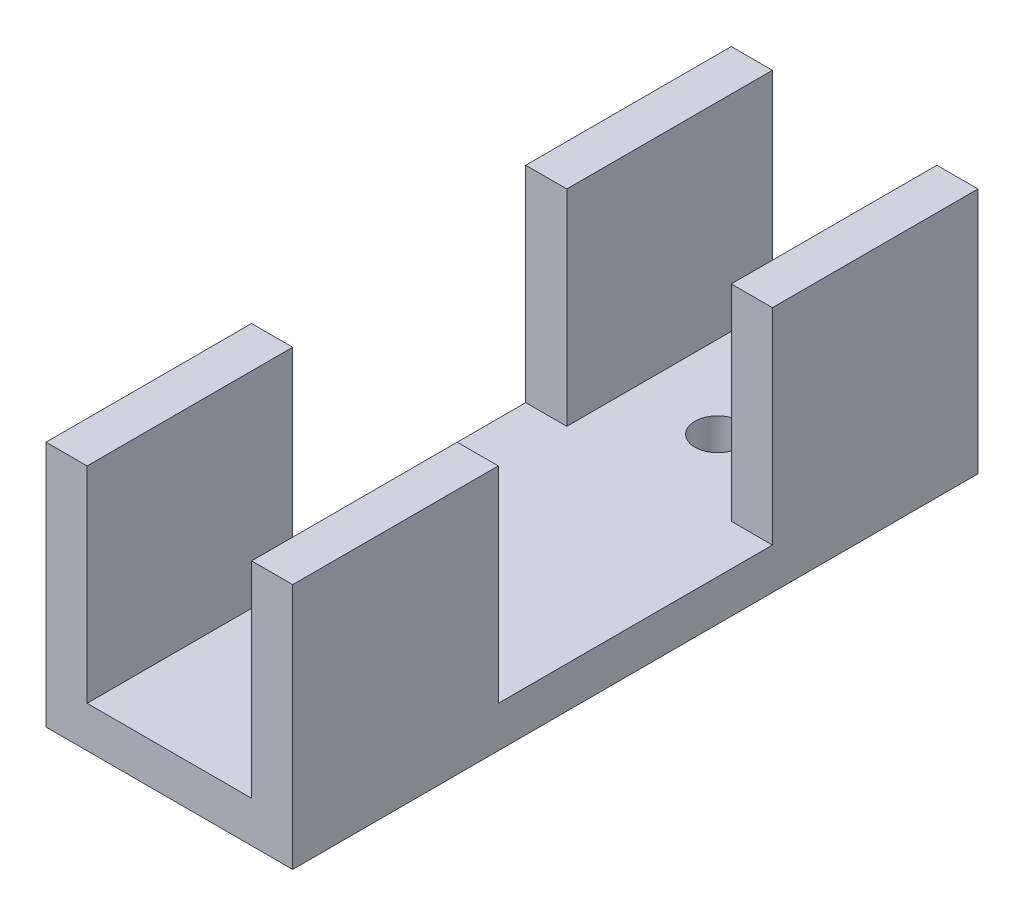
ISO-10303-21;
HEADER;
FILE_DESCRIPTION(('STEP AP214'),'2;1');
FILE_NAME('part.step','',(''),(''),'','','');
FILE_SCHEMA(('AUTOMOTIVE_DESIGN { 1 0 10303 214 1 1 1 1 }'));
ENDSEC;
DATA;
#1=APPLICATION_CONTEXT('core data for automotive mechanical design processes');
#2=APPLICATION_PROTOCOL_DEFINITION('international standard','automotive_design',2000,#1);
#3=PRODUCT_CONTEXT('',#1,'mechanical');
#4=PRODUCT('Part','Part','',(#3));
#5=PRODUCT_RELATED_PRODUCT_CATEGORY('part','',(#4));
#6=PRODUCT_DEFINITION_FORMATION('','',#4);
#7=PRODUCT_DEFINITION_CONTEXT('part definition',#1,'design');
#8=PRODUCT_DEFINITION('design','',#6,#7);
#9=PRODUCT_DEFINITION_SHAPE('','',#8);
#10=(LENGTH_UNIT() NAMED_UNIT(*) SI_UNIT(.MILLI.,.METRE.));
#11=(NAMED_UNIT(*) PLANE_ANGLE_UNIT() SI_UNIT($,.RADIAN.));
#12=(NAMED_UNIT(*) SI_UNIT($,.STERADIAN.) SOLID_ANGLE_UNIT());
#13=UNCERTAINTY_MEASURE_WITH_UNIT(LENGTH_MEASURE(1.E-05),#10,'distance_accuracy_value','');
#14=(GEOMETRIC_REPRESENTATION_CONTEXT(3) GLOBAL_UNCERTAINTY_ASSIGNED_CONTEXT((#13)) GLOBAL_UNIT_ASSIGNED_CONTEXT((#10,
#11,#12)) REPRESENTATION_CONTEXT('',''));
#15=CARTESIAN_POINT('',(0.,0.,0.));
#16=DIRECTION('',(0.,0.,1.));
#17=DIRECTION('',(1.,0.,0.));
#18=AXIS2_PLACEMENT_3D('',#15,#16,#17);
#19=CARTESIAN_POINT('',(0.,3.,0.));
#20=DIRECTION('',(0.,1.,0.));
#21=DIRECTION('',(0.,0.,1.));
#22=AXIS2_PLACEMENT_3D('',#19,#20,#21);
#23=PLANE('',#22);
#24=CARTESIAN_POINT('',(0.,3.,15.));
#25=DIRECTION('',(0.,1.,0.));
#26=DIRECTION('',(0.,0.,1.));
#27=AXIS2_PLACEMENT_3D('',#24,#25,#26);
#28=CIRCLE('',#27,1.65);
#29=CARTESIAN_POINT('',(0.,3.,16.65));
#30=VERTEX_POINT('',#29);
#31=EDGE_CURVE('E180',#30,#30,#28,.F.);
#32=ORIENTED_EDGE('',*,*,#31,.T.);
#33=EDGE_LOOP('',(#32));
#34=FACE_BOUND('',#33,.T.);
#35=CARTESIAN_POINT('',(0.,3.,-15.));
#36=DIRECTION('',(0.,1.,0.));
#37=DIRECTION('',(0.,0.,1.));
#38=AXIS2_PLACEMENT_3D('',#35,#36,#37);
#39=CIRCLE('',#38,1.65);
#40=CARTESIAN_POINT('',(0.,3.,-13.35));
#41=VERTEX_POINT('',#40);
#42=EDGE_CURVE('E174',#41,#41,#39,.F.);
#43=ORIENTED_EDGE('',*,*,#42,.T.);
#44=EDGE_LOOP('',(#43));
#45=FACE_BOUND('',#44,.T.);
#46=DIRECTION('',(0.,0.,1.));
#47=VECTOR('',#46,1.);
#48=CARTESIAN_POINT('',(5.99999999999999,3.,25.));
#49=LINE('',#48,#47);
#50=CARTESIAN_POINT('',(5.99999999999999,3.,10.));
#51=VERTEX_POINT('',#50);
#52=CARTESIAN_POINT('',(5.99999999999999,3.,25.));
#53=VERTEX_POINT('',#52);
#54=EDGE_CURVE('E48',#51,#53,#49,.T.);
#55=ORIENTED_EDGE('',*,*,#54,.F.);
#56=DIRECTION('',(-1.,0.,0.));
#57=VECTOR('',#56,1.);
#58=CARTESIAN_POINT('',(9.,3.,10.));
#59=LINE('',#58,#57);
#60=CARTESIAN_POINT('',(9.,3.,10.));
#61=VERTEX_POINT('',#60);
#62=EDGE_CURVE('E52',#61,#51,#59,.T.);
#63=ORIENTED_EDGE('',*,*,#62,.F.);
#64=DIRECTION('',(0.,0.,-1.));
#65=VECTOR('',#64,1.);
#66=CARTESIAN_POINT('',(8.99999999999999,3.,-25.));
#67=LINE('',#66,#65);
#68=CARTESIAN_POINT('',(9.,3.,-10.));
#69=VERTEX_POINT('',#68);
#70=EDGE_CURVE('E257',#61,#69,#67,.T.);
#71=ORIENTED_EDGE('',*,*,#70,.T.);
#72=DIRECTION('',(1.,0.,0.));
#73=VECTOR('',#72,1.);
#74=CARTESIAN_POINT('',(9.,3.,-10.));
#75=LINE('',#74,#73);
#76=CARTESIAN_POINT('',(5.99999999999999,3.,-10.));
#77=VERTEX_POINT('',#76);
#78=EDGE_CURVE('E237',#77,#69,#75,.T.);
#79=ORIENTED_EDGE('',*,*,#78,.F.);
#80=DIRECTION('',(0.,0.,1.));
#81=VECTOR('',#80,1.);
#82=CARTESIAN_POINT('',(5.99999999999999,3.,-25.));
#83=LINE('',#82,#81);
#84=CARTESIAN_POINT('',(5.99999999999999,3.,-25.));
#85=VERTEX_POINT('',#84);
#86=EDGE_CURVE('E232',#85,#77,#83,.T.);
#87=ORIENTED_EDGE('',*,*,#86,.F.);
#88=DIRECTION('',(-1.,0.,0.));
#89=VECTOR('',#88,1.);
#90=CARTESIAN_POINT('',(-9.00000000000001,3.,-25.));
#91=LINE('',#90,#89);
#92=CARTESIAN_POINT('',(-5.99999999999999,3.,-25.));
#93=VERTEX_POINT('',#92);
#94=EDGE_CURVE('E259',#85,#93,#91,.T.);
#95=ORIENTED_EDGE('',*,*,#94,.T.);
#96=DIRECTION('',(0.,0.,-1.));
#97=VECTOR('',#96,1.);
#98=CARTESIAN_POINT('',(-5.99999999999999,3.,-25.));
#99=LINE('',#98,#97);
#100=CARTESIAN_POINT('',(-5.99999999999999,3.,-10.));
#101=VERTEX_POINT('',#100);
#102=EDGE_CURVE('E216',#101,#93,#99,.T.);
#103=ORIENTED_EDGE('',*,*,#102,.F.);
#104=DIRECTION('',(1.,0.,0.));
#105=VECTOR('',#104,1.);
#106=CARTESIAN_POINT('',(-8.99999999999999,3.,-10.));
#107=LINE('',#106,#105);
#108=CARTESIAN_POINT('',(-8.99999999999999,3.,-10.));
#109=VERTEX_POINT('',#108);
#110=EDGE_CURVE('E211',#109,#101,#107,.T.);
#111=ORIENTED_EDGE('',*,*,#110,.F.);
#112=DIRECTION('',(0.,0.,1.));
#113=VECTOR('',#112,1.);
#114=CARTESIAN_POINT('',(-9.00000000000001,3.,-25.));
#115=LINE('',#114,#113);
#116=CARTESIAN_POINT('',(-9.,3.,10.));
#117=VERTEX_POINT('',#116);
#118=EDGE_CURVE('E262',#109,#117,#115,.T.);
#119=ORIENTED_EDGE('',*,*,#118,.T.);
#120=DIRECTION('',(-1.,0.,0.));
#121=VECTOR('',#120,1.);
#122=CARTESIAN_POINT('',(-8.99999999999999,3.,10.));
#123=LINE('',#122,#121);
#124=CARTESIAN_POINT('',(-5.99999999999999,3.,10.));
#125=VERTEX_POINT('',#124);
#126=EDGE_CURVE('E192',#125,#117,#123,.T.);
#127=ORIENTED_EDGE('',*,*,#126,.F.);
#128=DIRECTION('',(0.,0.,-1.));
#129=VECTOR('',#128,1.);
#130=CARTESIAN_POINT('',(-5.99999999999998,3.,25.));
#131=LINE('',#130,#129);
#132=CARTESIAN_POINT('',(-5.99999999999998,3.,25.));
#133=VERTEX_POINT('',#132);
#134=EDGE_CURVE('E187',#133,#125,#131,.T.);
#135=ORIENTED_EDGE('',*,*,#134,.F.);
#136=DIRECTION('',(1.,0.,0.));
#137=VECTOR('',#136,1.);
#138=CARTESIAN_POINT('',(-9.,3.,25.));
#139=LINE('',#138,#137);
#140=EDGE_CURVE('E157',#133,#53,#139,.T.);
#141=ORIENTED_EDGE('',*,*,#140,.T.);
#142=EDGE_LOOP('',(#55,#63,#71,#79,#87,#95,#103,#111,#119,#127,#135,#141));
#143=FACE_BOUND('',#142,.T.);
#144=ADVANCED_FACE('F33',(#34,#45,#143),#23,.T.);
#145=CARTESIAN_POINT('',(8.99999999999999,3.,-25.));
#146=DIRECTION('',(-1.,0.,0.));
#147=DIRECTION('',(0.,0.,1.));
#148=AXIS2_PLACEMENT_3D('',#145,#146,#147);
#149=PLANE('',#148);
#150=DIRECTION('',(0.,0.,-1.));
#151=VECTOR('',#150,1.);
#152=CARTESIAN_POINT('',(8.99999999999999,0.,-25.));
#153=LINE('',#152,#151);
#154=CARTESIAN_POINT('',(9.,0.,25.));
#155=VERTEX_POINT('',#154);
#156=CARTESIAN_POINT('',(8.99999999999999,0.,-25.));
#157=VERTEX_POINT('',#156);
#158=EDGE_CURVE('E256',#155,#157,#153,.T.);
#159=ORIENTED_EDGE('',*,*,#158,.T.);
#160=DIRECTION('',(0.,-1.,0.));
#161=VECTOR('',#160,1.);
#162=CARTESIAN_POINT('',(8.99999999999999,3.,-25.));
#163=LINE('',#162,#161);
#164=CARTESIAN_POINT('',(8.99999999999999,18.,-25.));
#165=VERTEX_POINT('',#164);
#166=EDGE_CURVE('E11',#165,#157,#163,.T.);
#167=ORIENTED_EDGE('',*,*,#166,.F.);
#168=DIRECTION('',(0.,0.,-1.));
#169=VECTOR('',#168,1.);
#170=CARTESIAN_POINT('',(8.99999999999999,18.,-25.));
#171=LINE('',#170,#169);
#172=CARTESIAN_POINT('',(9.,18.,-10.));
#173=VERTEX_POINT('',#172);
#174=EDGE_CURVE('E233',#173,#165,#171,.T.);
#175=ORIENTED_EDGE('',*,*,#174,.F.);
#176=DIRECTION('',(0.,-1.,0.));
#177=VECTOR('',#176,1.);
#178=CARTESIAN_POINT('',(9.,18.,-10.));
#179=LINE('',#178,#177);
#180=EDGE_CURVE('E243',#173,#69,#179,.T.);
#181=ORIENTED_EDGE('',*,*,#180,.T.);
#182=ORIENTED_EDGE('',*,*,#70,.F.);
#183=DIRECTION('',(0.,-1.,0.));
#184=VECTOR('',#183,1.);
#185=CARTESIAN_POINT('',(9.,18.,10.));
#186=LINE('',#185,#184);
#187=CARTESIAN_POINT('',(9.,18.,10.));
#188=VERTEX_POINT('',#187);
#189=EDGE_CURVE('E162',#188,#61,#186,.T.);
#190=ORIENTED_EDGE('',*,*,#189,.F.);
#191=DIRECTION('',(0.,0.,-1.));
#192=VECTOR('',#191,1.);
#193=CARTESIAN_POINT('',(9.,18.,25.));
#194=LINE('',#193,#192);
#195=CARTESIAN_POINT('',(9.,18.,25.));
#196=VERTEX_POINT('',#195);
#197=EDGE_CURVE('E160',#196,#188,#194,.T.);
#198=ORIENTED_EDGE('',*,*,#197,.F.);
#199=DIRECTION('',(0.,-1.,0.));
#200=VECTOR('',#199,1.);
#201=CARTESIAN_POINT('',(9.,3.,25.));
#202=LINE('',#201,#200);
#203=EDGE_CURVE('E144',#196,#155,#202,.T.);
#204=ORIENTED_EDGE('',*,*,#203,.T.);
#205=EDGE_LOOP('',(#159,#167,#175,#181,#182,#190,#198,#204));
#206=FACE_BOUND('',#205,.T.);
#207=ADVANCED_FACE('F35',(#206),#149,.F.);
#208=CARTESIAN_POINT('',(-9.00000000000001,3.,-25.));
#209=DIRECTION('',(0.,0.,1.));
#210=DIRECTION('',(1.,0.,0.));
#211=AXIS2_PLACEMENT_3D('',#208,#209,#210);
#212=PLANE('',#211);
#213=DIRECTION('',(-1.,0.,0.));
#214=VECTOR('',#213,1.);
#215=CARTESIAN_POINT('',(-9.00000000000001,0.,-25.));
#216=LINE('',#215,#214);
#217=CARTESIAN_POINT('',(-9.00000000000001,0.,-25.));
#218=VERTEX_POINT('',#217);
#219=EDGE_CURVE('E266',#157,#218,#216,.T.);
#220=ORIENTED_EDGE('',*,*,#219,.T.);
#221=DIRECTION('',(0.,-1.,0.));
#222=VECTOR('',#221,1.);
#223=CARTESIAN_POINT('',(-9.00000000000001,3.,-25.));
#224=LINE('',#223,#222);
#225=CARTESIAN_POINT('',(-9.00000000000001,18.,-25.));
#226=VERTEX_POINT('',#225);
#227=EDGE_CURVE('E41',#226,#218,#224,.T.);
#228=ORIENTED_EDGE('',*,*,#227,.F.);
#229=DIRECTION('',(-1.,0.,0.));
#230=VECTOR('',#229,1.);
#231=CARTESIAN_POINT('',(-9.00000000000001,18.,-25.));
#232=LINE('',#231,#230);
#233=CARTESIAN_POINT('',(-5.99999999999999,18.,-25.));
#234=VERTEX_POINT('',#233);
#235=EDGE_CURVE('E212',#234,#226,#232,.T.);
#236=ORIENTED_EDGE('',*,*,#235,.F.);
#237=DIRECTION('',(0.,-1.,0.));
#238=VECTOR('',#237,1.);
#239=CARTESIAN_POINT('',(-5.99999999999999,18.,-25.));
#240=LINE('',#239,#238);
#241=EDGE_CURVE('E222',#234,#93,#240,.T.);
#242=ORIENTED_EDGE('',*,*,#241,.T.);
#243=ORIENTED_EDGE('',*,*,#94,.F.);
#244=DIRECTION('',(0.,-1.,0.));
#245=VECTOR('',#244,1.);
#246=CARTESIAN_POINT('',(5.99999999999999,18.,-25.));
#247=LINE('',#246,#245);
#248=CARTESIAN_POINT('',(5.99999999999999,18.,-25.));
#249=VERTEX_POINT('',#248);
#250=EDGE_CURVE('E253',#249,#85,#247,.T.);
#251=ORIENTED_EDGE('',*,*,#250,.F.);
#252=DIRECTION('',(-1.,0.,0.));
#253=VECTOR('',#252,1.);
#254=CARTESIAN_POINT('',(8.99999999999999,18.,-25.));
#255=LINE('',#254,#253);
#256=EDGE_CURVE('E236',#165,#249,#255,.T.);
#257=ORIENTED_EDGE('',*,*,#256,.F.);
#258=ORIENTED_EDGE('',*,*,#166,.T.);
#259=EDGE_LOOP('',(#220,#228,#236,#242,#243,#251,#257,#258));
#260=FACE_BOUND('',#259,.T.);
#261=ADVANCED_FACE('F284',(#260),#212,.F.);
#262=CARTESIAN_POINT('',(-9.00000000000001,3.,-25.));
#263=DIRECTION('',(1.,0.,0.));
#264=DIRECTION('',(0.,0.,-1.));
#265=AXIS2_PLACEMENT_3D('',#262,#263,#264);
#266=PLANE('',#265);
#267=DIRECTION('',(0.,0.,1.));
#268=VECTOR('',#267,1.);
#269=CARTESIAN_POINT('',(-9.00000000000001,0.,-25.));
#270=LINE('',#269,#268);
#271=CARTESIAN_POINT('',(-9.,0.,25.));
#272=VERTEX_POINT('',#271);
#273=EDGE_CURVE('E268',#218,#272,#270,.T.);
#274=ORIENTED_EDGE('',*,*,#273,.T.);
#275=DIRECTION('',(0.,-1.,0.));
#276=VECTOR('',#275,1.);
#277=CARTESIAN_POINT('',(-9.,3.,25.));
#278=LINE('',#277,#276);
#279=CARTESIAN_POINT('',(-9.,18.,25.));
#280=VERTEX_POINT('',#279);
#281=EDGE_CURVE('E156',#280,#272,#278,.T.);
#282=ORIENTED_EDGE('',*,*,#281,.F.);
#283=DIRECTION('',(0.,0.,1.));
#284=VECTOR('',#283,1.);
#285=CARTESIAN_POINT('',(-9.,18.,25.));
#286=LINE('',#285,#284);
#287=CARTESIAN_POINT('',(-8.99999999999999,18.,10.));
#288=VERTEX_POINT('',#287);
#289=EDGE_CURVE('E188',#288,#280,#286,.T.);
#290=ORIENTED_EDGE('',*,*,#289,.F.);
#291=DIRECTION('',(0.,-1.,0.));
#292=VECTOR('',#291,1.);
#293=CARTESIAN_POINT('',(-8.99999999999999,18.,10.));
#294=LINE('',#293,#292);
#295=EDGE_CURVE('E198',#288,#117,#294,.T.);
#296=ORIENTED_EDGE('',*,*,#295,.T.);
#297=ORIENTED_EDGE('',*,*,#118,.F.);
#298=DIRECTION('',(0.,-1.,0.));
#299=VECTOR('',#298,1.);
#300=CARTESIAN_POINT('',(-8.99999999999999,18.,-10.));
#301=LINE('',#300,#299);
#302=CARTESIAN_POINT('',(-8.99999999999999,18.,-10.));
#303=VERTEX_POINT('',#302);
#304=EDGE_CURVE('E230',#303,#109,#301,.T.);
#305=ORIENTED_EDGE('',*,*,#304,.F.);
#306=DIRECTION('',(0.,0.,1.));
#307=VECTOR('',#306,1.);
#308=CARTESIAN_POINT('',(-9.00000000000001,18.,-25.));
#309=LINE('',#308,#307);
#310=EDGE_CURVE('E215',#226,#303,#309,.T.);
#311=ORIENTED_EDGE('',*,*,#310,.F.);
#312=ORIENTED_EDGE('',*,*,#227,.T.);
#313=EDGE_LOOP('',(#274,#282,#290,#296,#297,#305,#311,#312));
#314=FACE_BOUND('',#313,.T.);
#315=ADVANCED_FACE('F275',(#314),#266,.F.);
#316=CARTESIAN_POINT('',(-9.,3.,25.));
#317=DIRECTION('',(0.,0.,-1.));
#318=DIRECTION('',(-1.,0.,0.));
#319=AXIS2_PLACEMENT_3D('',#316,#317,#318);
#320=PLANE('',#319);
#321=DIRECTION('',(1.,0.,0.));
#322=VECTOR('',#321,1.);
#323=CARTESIAN_POINT('',(-9.,0.,25.));
#324=LINE('',#323,#322);
#325=EDGE_CURVE('E152',#272,#155,#324,.T.);
#326=ORIENTED_EDGE('',*,*,#325,.T.);
#327=ORIENTED_EDGE('',*,*,#203,.F.);
#328=DIRECTION('',(1.,0.,0.));
#329=VECTOR('',#328,1.);
#330=CARTESIAN_POINT('',(9.,18.,25.));
#331=LINE('',#330,#329);
#332=CARTESIAN_POINT('',(5.99999999999999,18.,25.));
#333=VERTEX_POINT('',#332);
#334=EDGE_CURVE('E149',#333,#196,#331,.T.);
#335=ORIENTED_EDGE('',*,*,#334,.F.);
#336=DIRECTION('',(0.,-1.,0.));
#337=VECTOR('',#336,1.);
#338=CARTESIAN_POINT('',(5.99999999999999,18.,25.));
#339=LINE('',#338,#337);
#340=EDGE_CURVE('E179',#333,#53,#339,.T.);
#341=ORIENTED_EDGE('',*,*,#340,.T.);
#342=ORIENTED_EDGE('',*,*,#140,.F.);
#343=DIRECTION('',(0.,-1.,0.));
#344=VECTOR('',#343,1.);
#345=CARTESIAN_POINT('',(-5.99999999999998,18.,25.));
#346=LINE('',#345,#344);
#347=CARTESIAN_POINT('',(-5.99999999999998,18.,25.));
#348=VERTEX_POINT('',#347);
#349=EDGE_CURVE('E208',#348,#133,#346,.T.);
#350=ORIENTED_EDGE('',*,*,#349,.F.);
#351=DIRECTION('',(1.,0.,0.));
#352=VECTOR('',#351,1.);
#353=CARTESIAN_POINT('',(-9.,18.,25.));
#354=LINE('',#353,#352);
#355=EDGE_CURVE('E191',#280,#348,#354,.T.);
#356=ORIENTED_EDGE('',*,*,#355,.F.);
#357=ORIENTED_EDGE('',*,*,#281,.T.);
#358=EDGE_LOOP('',(#326,#327,#335,#341,#342,#350,#356,#357));
#359=FACE_BOUND('',#358,.T.);
#360=ADVANCED_FACE('F146',(#359),#320,.F.);
#361=CARTESIAN_POINT('',(0.,0.,0.));
#362=DIRECTION('',(0.,1.,0.));
#363=DIRECTION('',(0.,0.,1.));
#364=AXIS2_PLACEMENT_3D('',#361,#362,#363);
#365=PLANE('',#364);
#366=CARTESIAN_POINT('',(0.,0.,15.));
#367=DIRECTION('',(0.,-1.,0.));
#368=DIRECTION('',(0.,0.,-1.));
#369=AXIS2_PLACEMENT_3D('',#366,#367,#368);
#370=CIRCLE('',#369,1.65);
#371=CARTESIAN_POINT('',(0.,0.,13.35));
#372=VERTEX_POINT('',#371);
#373=EDGE_CURVE('E515',#372,#372,#370,.T.);
#374=ORIENTED_EDGE('',*,*,#373,.F.);
#375=EDGE_LOOP('',(#374));
#376=FACE_BOUND('',#375,.T.);
#377=CARTESIAN_POINT('',(0.,0.,-15.));
#378=DIRECTION('',(0.,-1.,0.));
#379=DIRECTION('',(0.,0.,1.));
#380=AXIS2_PLACEMENT_3D('',#377,#378,#379);
#381=CIRCLE('',#380,1.65);
#382=CARTESIAN_POINT('',(0.,0.,-13.35));
#383=VERTEX_POINT('',#382);
#384=EDGE_CURVE('E519',#383,#383,#381,.T.);
#385=ORIENTED_EDGE('',*,*,#384,.F.);
#386=EDGE_LOOP('',(#385));
#387=FACE_BOUND('',#386,.T.);
#388=ORIENTED_EDGE('',*,*,#158,.F.);
#389=ORIENTED_EDGE('',*,*,#325,.F.);
#390=ORIENTED_EDGE('',*,*,#273,.F.);
#391=ORIENTED_EDGE('',*,*,#219,.F.);
#392=EDGE_LOOP('',(#388,#389,#390,#391));
#393=FACE_BOUND('',#392,.T.);
#394=ADVANCED_FACE('F280',(#376,#387,#393),#365,.F.);
#395=CARTESIAN_POINT('',(5.99999999999999,18.,-25.));
#396=DIRECTION('',(1.,0.,0.));
#397=DIRECTION('',(0.,0.,-1.));
#398=AXIS2_PLACEMENT_3D('',#395,#396,#397);
#399=PLANE('',#398);
#400=ORIENTED_EDGE('',*,*,#86,.T.);
#401=DIRECTION('',(0.,-1.,0.));
#402=VECTOR('',#401,1.);
#403=CARTESIAN_POINT('',(5.99999999999999,18.,-10.));
#404=LINE('',#403,#402);
#405=CARTESIAN_POINT('',(5.99999999999999,18.,-10.));
#406=VERTEX_POINT('',#405);
#407=EDGE_CURVE('E250',#406,#77,#404,.T.);
#408=ORIENTED_EDGE('',*,*,#407,.F.);
#409=DIRECTION('',(0.,0.,1.));
#410=VECTOR('',#409,1.);
#411=CARTESIAN_POINT('',(5.99999999999999,18.,-25.));
#412=LINE('',#411,#410);
#413=EDGE_CURVE('E239',#249,#406,#412,.T.);
#414=ORIENTED_EDGE('',*,*,#413,.F.);
#415=ORIENTED_EDGE('',*,*,#250,.T.);
#416=EDGE_LOOP('',(#400,#408,#414,#415));
#417=FACE_BOUND('',#416,.T.);
#418=ADVANCED_FACE('F333',(#417),#399,.F.);
#419=CARTESIAN_POINT('',(9.,18.,-10.));
#420=DIRECTION('',(0.,0.,-1.));
#421=DIRECTION('',(-1.,0.,0.));
#422=AXIS2_PLACEMENT_3D('',#419,#420,#421);
#423=PLANE('',#422);
#424=ORIENTED_EDGE('',*,*,#78,.T.);
#425=ORIENTED_EDGE('',*,*,#180,.F.);
#426=DIRECTION('',(1.,0.,0.));
#427=VECTOR('',#426,1.);
#428=CARTESIAN_POINT('',(9.,18.,-10.));
#429=LINE('',#428,#427);
#430=EDGE_CURVE('E241',#406,#173,#429,.T.);
#431=ORIENTED_EDGE('',*,*,#430,.F.);
#432=ORIENTED_EDGE('',*,*,#407,.T.);
#433=EDGE_LOOP('',(#424,#425,#431,#432));
#434=FACE_BOUND('',#433,.T.);
#435=ADVANCED_FACE('F293',(#434),#423,.F.);
#436=CARTESIAN_POINT('',(0.,18.,0.));
#437=DIRECTION('',(0.,-1.,0.));
#438=DIRECTION('',(0.,0.,-1.));
#439=AXIS2_PLACEMENT_3D('',#436,#437,#438);
#440=PLANE('',#439);
#441=ORIENTED_EDGE('',*,*,#174,.T.);
#442=ORIENTED_EDGE('',*,*,#256,.T.);
#443=ORIENTED_EDGE('',*,*,#413,.T.);
#444=ORIENTED_EDGE('',*,*,#430,.T.);
#445=EDGE_LOOP('',(#441,#442,#443,#444));
#446=FACE_BOUND('',#445,.T.);
#447=ADVANCED_FACE('F288',(#446),#440,.F.);
#448=CARTESIAN_POINT('',(-8.99999999999999,18.,-10.));
#449=DIRECTION('',(0.,0.,-1.));
#450=DIRECTION('',(-1.,0.,0.));
#451=AXIS2_PLACEMENT_3D('',#448,#449,#450);
#452=PLANE('',#451);
#453=ORIENTED_EDGE('',*,*,#110,.T.);
#454=DIRECTION('',(0.,-1.,0.));
#455=VECTOR('',#454,1.);
#456=CARTESIAN_POINT('',(-5.99999999999999,18.,-10.));
#457=LINE('',#456,#455);
#458=CARTESIAN_POINT('',(-5.99999999999999,18.,-10.));
#459=VERTEX_POINT('',#458);
#460=EDGE_CURVE('E228',#459,#101,#457,.T.);
#461=ORIENTED_EDGE('',*,*,#460,.F.);
#462=DIRECTION('',(1.,0.,0.));
#463=VECTOR('',#462,1.);
#464=CARTESIAN_POINT('',(-8.99999999999999,18.,-10.));
#465=LINE('',#464,#463);
#466=EDGE_CURVE('E218',#303,#459,#465,.T.);
#467=ORIENTED_EDGE('',*,*,#466,.F.);
#468=ORIENTED_EDGE('',*,*,#304,.T.);
#469=EDGE_LOOP('',(#453,#461,#467,#468));
#470=FACE_BOUND('',#469,.T.);
#471=ADVANCED_FACE('F376',(#470),#452,.F.);
#472=CARTESIAN_POINT('',(-5.99999999999999,18.,-25.));
#473=DIRECTION('',(-1.,0.,0.));
#474=DIRECTION('',(0.,0.,1.));
#475=AXIS2_PLACEMENT_3D('',#472,#473,#474);
#476=PLANE('',#475);
#477=ORIENTED_EDGE('',*,*,#102,.T.);
#478=ORIENTED_EDGE('',*,*,#241,.F.);
#479=DIRECTION('',(0.,0.,-1.));
#480=VECTOR('',#479,1.);
#481=CARTESIAN_POINT('',(-5.99999999999999,18.,-25.));
#482=LINE('',#481,#480);
#483=EDGE_CURVE('E220',#459,#234,#482,.T.);
#484=ORIENTED_EDGE('',*,*,#483,.F.);
#485=ORIENTED_EDGE('',*,*,#460,.T.);
#486=EDGE_LOOP('',(#477,#478,#484,#485));
#487=FACE_BOUND('',#486,.T.);
#488=ADVANCED_FACE('F383',(#487),#476,.F.);
#489=CARTESIAN_POINT('',(0.,18.,0.));
#490=DIRECTION('',(0.,-1.,0.));
#491=DIRECTION('',(0.,0.,-1.));
#492=AXIS2_PLACEMENT_3D('',#489,#490,#491);
#493=PLANE('',#492);
#494=ORIENTED_EDGE('',*,*,#235,.T.);
#495=ORIENTED_EDGE('',*,*,#310,.T.);
#496=ORIENTED_EDGE('',*,*,#466,.T.);
#497=ORIENTED_EDGE('',*,*,#483,.T.);
#498=EDGE_LOOP('',(#494,#495,#496,#497));
#499=FACE_BOUND('',#498,.T.);
#500=ADVANCED_FACE('F321',(#499),#493,.F.);
#501=CARTESIAN_POINT('',(-5.99999999999998,18.,25.));
#502=DIRECTION('',(-1.,0.,0.));
#503=DIRECTION('',(0.,0.,1.));
#504=AXIS2_PLACEMENT_3D('',#501,#502,#503);
#505=PLANE('',#504);
#506=ORIENTED_EDGE('',*,*,#134,.T.);
#507=DIRECTION('',(0.,-1.,0.));
#508=VECTOR('',#507,1.);
#509=CARTESIAN_POINT('',(-5.99999999999999,18.,10.));
#510=LINE('',#509,#508);
#511=CARTESIAN_POINT('',(-5.99999999999999,18.,10.));
#512=VERTEX_POINT('',#511);
#513=EDGE_CURVE('E205',#512,#125,#510,.T.);
#514=ORIENTED_EDGE('',*,*,#513,.F.);
#515=DIRECTION('',(0.,0.,-1.));
#516=VECTOR('',#515,1.);
#517=CARTESIAN_POINT('',(-5.99999999999998,18.,25.));
#518=LINE('',#517,#516);
#519=EDGE_CURVE('E194',#348,#512,#518,.T.);
#520=ORIENTED_EDGE('',*,*,#519,.F.);
#521=ORIENTED_EDGE('',*,*,#349,.T.);
#522=EDGE_LOOP('',(#506,#514,#520,#521));
#523=FACE_BOUND('',#522,.T.);
#524=ADVANCED_FACE('F305',(#523),#505,.F.);
#525=CARTESIAN_POINT('',(-8.99999999999999,18.,10.));
#526=DIRECTION('',(0.,0.,1.));
#527=DIRECTION('',(1.,0.,0.));
#528=AXIS2_PLACEMENT_3D('',#525,#526,#527);
#529=PLANE('',#528);
#530=ORIENTED_EDGE('',*,*,#126,.T.);
#531=ORIENTED_EDGE('',*,*,#295,.F.);
#532=DIRECTION('',(-1.,0.,0.));
#533=VECTOR('',#532,1.);
#534=CARTESIAN_POINT('',(-8.99999999999999,18.,10.));
#535=LINE('',#534,#533);
#536=EDGE_CURVE('E196',#512,#288,#535,.T.);
#537=ORIENTED_EDGE('',*,*,#536,.F.);
#538=ORIENTED_EDGE('',*,*,#513,.T.);
#539=EDGE_LOOP('',(#530,#531,#537,#538));
#540=FACE_BOUND('',#539,.T.);
#541=ADVANCED_FACE('F313',(#540),#529,.F.);
#542=CARTESIAN_POINT('',(0.,18.,0.));
#543=DIRECTION('',(0.,-1.,0.));
#544=DIRECTION('',(0.,0.,-1.));
#545=AXIS2_PLACEMENT_3D('',#542,#543,#544);
#546=PLANE('',#545);
#547=ORIENTED_EDGE('',*,*,#289,.T.);
#548=ORIENTED_EDGE('',*,*,#355,.T.);
#549=ORIENTED_EDGE('',*,*,#519,.T.);
#550=ORIENTED_EDGE('',*,*,#536,.T.);
#551=EDGE_LOOP('',(#547,#548,#549,#550));
#552=FACE_BOUND('',#551,.T.);
#553=ADVANCED_FACE('F308',(#552),#546,.F.);
#554=CARTESIAN_POINT('',(9.,18.,10.));
#555=DIRECTION('',(0.,0.,1.));
#556=DIRECTION('',(1.,0.,0.));
#557=AXIS2_PLACEMENT_3D('',#554,#555,#556);
#558=PLANE('',#557);
#559=ORIENTED_EDGE('',*,*,#62,.T.);
#560=DIRECTION('',(0.,-1.,0.));
#561=VECTOR('',#560,1.);
#562=CARTESIAN_POINT('',(5.99999999999999,18.,10.));
#563=LINE('',#562,#561);
#564=CARTESIAN_POINT('',(5.99999999999999,18.,10.));
#565=VERTEX_POINT('',#564);
#566=EDGE_CURVE('E183',#565,#51,#563,.T.);
#567=ORIENTED_EDGE('',*,*,#566,.F.);
#568=DIRECTION('',(-1.,0.,0.));
#569=VECTOR('',#568,1.);
#570=CARTESIAN_POINT('',(9.,18.,10.));
#571=LINE('',#570,#569);
#572=EDGE_CURVE('E165',#188,#565,#571,.T.);
#573=ORIENTED_EDGE('',*,*,#572,.F.);
#574=ORIENTED_EDGE('',*,*,#189,.T.);
#575=EDGE_LOOP('',(#559,#567,#573,#574));
#576=FACE_BOUND('',#575,.T.);
#577=ADVANCED_FACE('F295',(#576),#558,.F.);
#578=CARTESIAN_POINT('',(5.99999999999999,18.,25.));
#579=DIRECTION('',(1.,0.,0.));
#580=DIRECTION('',(0.,0.,-1.));
#581=AXIS2_PLACEMENT_3D('',#578,#579,#580);
#582=PLANE('',#581);
#583=ORIENTED_EDGE('',*,*,#54,.T.);
#584=ORIENTED_EDGE('',*,*,#340,.F.);
#585=DIRECTION('',(0.,0.,1.));
#586=VECTOR('',#585,1.);
#587=CARTESIAN_POINT('',(5.99999999999999,18.,25.));
#588=LINE('',#587,#586);
#589=EDGE_CURVE('E169',#565,#333,#588,.T.);
#590=ORIENTED_EDGE('',*,*,#589,.F.);
#591=ORIENTED_EDGE('',*,*,#566,.T.);
#592=EDGE_LOOP('',(#583,#584,#590,#591));
#593=FACE_BOUND('',#592,.T.);
#594=ADVANCED_FACE('F298',(#593),#582,.F.);
#595=CARTESIAN_POINT('',(0.,18.,0.));
#596=DIRECTION('',(0.,-1.,0.));
#597=DIRECTION('',(0.,0.,-1.));
#598=AXIS2_PLACEMENT_3D('',#595,#596,#597);
#599=PLANE('',#598);
#600=ORIENTED_EDGE('',*,*,#334,.T.);
#601=ORIENTED_EDGE('',*,*,#197,.T.);
#602=ORIENTED_EDGE('',*,*,#572,.T.);
#603=ORIENTED_EDGE('',*,*,#589,.T.);
#604=EDGE_LOOP('',(#600,#601,#602,#603));
#605=FACE_BOUND('',#604,.T.);
#606=ADVANCED_FACE('F167',(#605),#599,.F.);
#607=CARTESIAN_POINT('',(0.,7.66690475583121,-15.));
#608=DIRECTION('',(0.,-1.,0.));
#609=DIRECTION('',(0.,0.,-1.));
#610=AXIS2_PLACEMENT_3D('',#607,#608,#609);
#611=CYLINDRICAL_SURFACE('',#610,1.65);
#612=ORIENTED_EDGE('',*,*,#384,.T.);
#613=EDGE_LOOP('',(#612));
#614=FACE_BOUND('',#613,.T.);
#615=ORIENTED_EDGE('',*,*,#42,.F.);
#616=EDGE_LOOP('',(#615));
#617=FACE_BOUND('',#616,.T.);
#618=ADVANCED_FACE('F437',(#614,#617),#611,.F.);
#619=CARTESIAN_POINT('',(0.,7.66690475583121,15.));
#620=DIRECTION('',(0.,-1.,0.));
#621=DIRECTION('',(0.,0.,-1.));
#622=AXIS2_PLACEMENT_3D('',#619,#620,#621);
#623=CYLINDRICAL_SURFACE('',#622,1.65);
#624=ORIENTED_EDGE('',*,*,#373,.T.);
#625=EDGE_LOOP('',(#624));
#626=FACE_BOUND('',#625,.T.);
#627=ORIENTED_EDGE('',*,*,#31,.F.);
#628=EDGE_LOOP('',(#627));
#629=FACE_BOUND('',#628,.T.);
#630=ADVANCED_FACE('F498',(#626,#629),#623,.F.);
#631=CLOSED_SHELL('',(#144,#207,#261,#315,#360,#394,#418,#435,#447,#471,#488,#500,#524,#541,
#553,#577,#594,#606,#618,#630));
#632=MANIFOLD_SOLID_BREP('B2',#631);
#633=ADVANCED_BREP_SHAPE_REPRESENTATION('',(#18,#632),#14);
#634=SHAPE_DEFINITION_REPRESENTATION(#9,#633);
ENDSEC;
END-ISO-10303-21;
